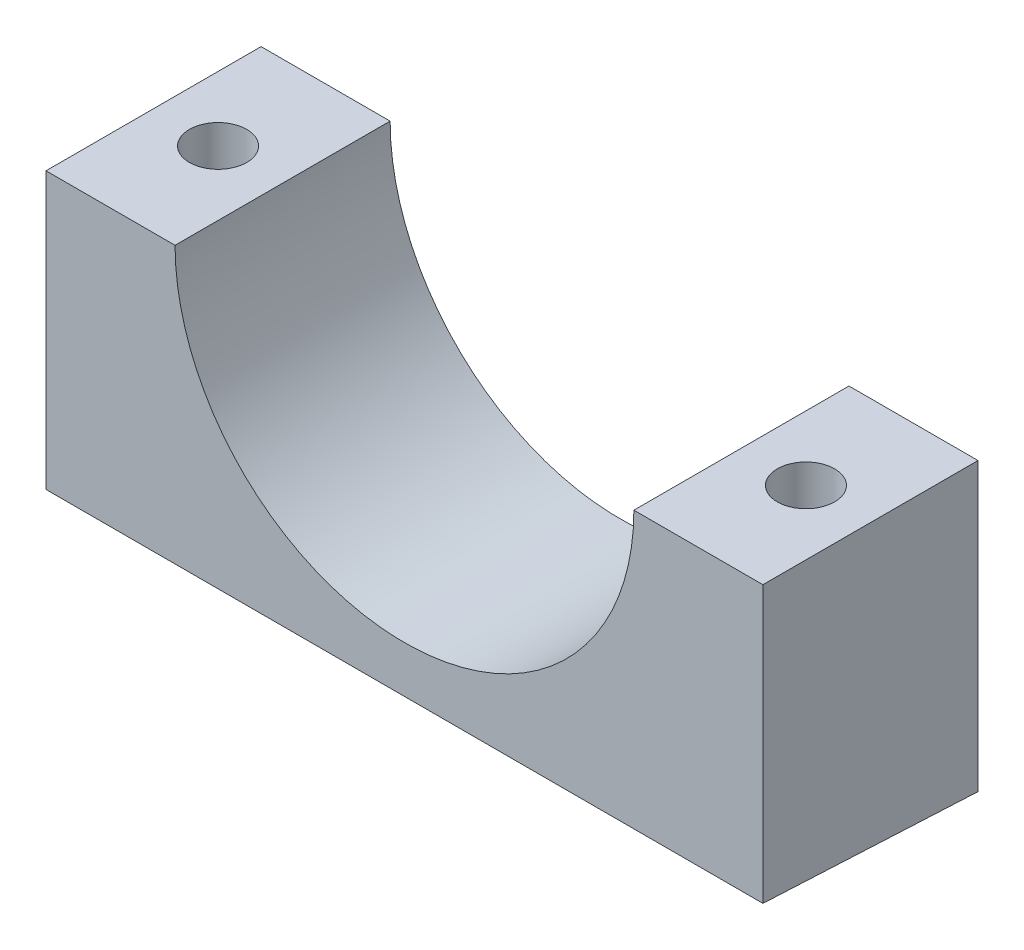
ISO-10303-21;
HEADER;
FILE_DESCRIPTION(('STEP AP214'),'2;1');
FILE_NAME('part.step','',(''),(''),'','','');
FILE_SCHEMA(('AUTOMOTIVE_DESIGN { 1 0 10303 214 1 1 1 1 }'));
ENDSEC;
DATA;
#1=APPLICATION_CONTEXT('core data for automotive mechanical design processes');
#2=APPLICATION_PROTOCOL_DEFINITION('international standard','automotive_design',2000,#1);
#3=PRODUCT_CONTEXT('',#1,'mechanical');
#4=PRODUCT('Part','Part','',(#3));
#5=PRODUCT_RELATED_PRODUCT_CATEGORY('part','',(#4));
#6=PRODUCT_DEFINITION_FORMATION('','',#4);
#7=PRODUCT_DEFINITION_CONTEXT('part definition',#1,'design');
#8=PRODUCT_DEFINITION('design','',#6,#7);
#9=PRODUCT_DEFINITION_SHAPE('','',#8);
#10=(LENGTH_UNIT() NAMED_UNIT(*) SI_UNIT(.MILLI.,.METRE.));
#11=(NAMED_UNIT(*) PLANE_ANGLE_UNIT() SI_UNIT($,.RADIAN.));
#12=(NAMED_UNIT(*) SI_UNIT($,.STERADIAN.) SOLID_ANGLE_UNIT());
#13=UNCERTAINTY_MEASURE_WITH_UNIT(LENGTH_MEASURE(1.E-05),#10,'distance_accuracy_value','');
#14=(GEOMETRIC_REPRESENTATION_CONTEXT(3) GLOBAL_UNCERTAINTY_ASSIGNED_CONTEXT((#13)) GLOBAL_UNIT_ASSIGNED_CONTEXT((#10,
#11,#12)) REPRESENTATION_CONTEXT('',''));
#15=CARTESIAN_POINT('',(0.,0.,0.));
#16=DIRECTION('',(0.,0.,1.));
#17=DIRECTION('',(1.,0.,0.));
#18=AXIS2_PLACEMENT_3D('',#15,#16,#17);
#19=CARTESIAN_POINT('',(-25.,10.,15.));
#20=DIRECTION('',(0.,-1.,0.));
#21=DIRECTION('',(0.,0.,-1.));
#22=AXIS2_PLACEMENT_3D('',#19,#20,#21);
#23=PLANE('',#22);
#24=CARTESIAN_POINT('',(-20.5,10.,7.5));
#25=DIRECTION('',(0.,-1.,0.));
#26=DIRECTION('',(0.,0.,1.));
#27=AXIS2_PLACEMENT_3D('',#24,#25,#26);
#28=CIRCLE('',#27,2.);
#29=CARTESIAN_POINT('',(-20.5,10.,9.5));
#30=VERTEX_POINT('',#29);
#31=EDGE_CURVE('E149',#30,#30,#28,.T.);
#32=ORIENTED_EDGE('',*,*,#31,.T.);
#33=EDGE_LOOP('',(#32));
#34=FACE_BOUND('',#33,.T.);
#35=DIRECTION('',(-1.,0.,0.));
#36=VECTOR('',#35,1.);
#37=CARTESIAN_POINT('',(-25.,10.,15.));
#38=LINE('',#37,#36);
#39=CARTESIAN_POINT('',(-16.,10.,15.));
#40=VERTEX_POINT('',#39);
#41=CARTESIAN_POINT('',(-25.,10.,15.));
#42=VERTEX_POINT('',#41);
#43=EDGE_CURVE('E101',#40,#42,#38,.T.);
#44=ORIENTED_EDGE('',*,*,#43,.F.);
#45=DIRECTION('',(0.,0.,-1.));
#46=VECTOR('',#45,1.);
#47=CARTESIAN_POINT('',(-16.,10.,15.));
#48=LINE('',#47,#46);
#49=CARTESIAN_POINT('',(-16.,10.,0.));
#50=VERTEX_POINT('',#49);
#51=EDGE_CURVE('E89',#40,#50,#48,.T.);
#52=ORIENTED_EDGE('',*,*,#51,.T.);
#53=DIRECTION('',(-1.,0.,0.));
#54=VECTOR('',#53,1.);
#55=CARTESIAN_POINT('',(-25.,10.,0.));
#56=LINE('',#55,#54);
#57=CARTESIAN_POINT('',(-25.,10.,0.));
#58=VERTEX_POINT('',#57);
#59=EDGE_CURVE('E118',#50,#58,#56,.T.);
#60=ORIENTED_EDGE('',*,*,#59,.T.);
#61=DIRECTION('',(0.,0.,-1.));
#62=VECTOR('',#61,1.);
#63=CARTESIAN_POINT('',(-25.,10.,15.));
#64=LINE('',#63,#62);
#65=EDGE_CURVE('E45',#42,#58,#64,.T.);
#66=ORIENTED_EDGE('',*,*,#65,.F.);
#67=EDGE_LOOP('',(#44,#52,#60,#66));
#68=FACE_BOUND('',#67,.T.);
#69=ADVANCED_FACE('F37',(#34,#68),#23,.F.);
#70=CARTESIAN_POINT('',(25.,-10.,15.));
#71=DIRECTION('',(-1.,0.,0.));
#72=DIRECTION('',(0.,0.,1.));
#73=AXIS2_PLACEMENT_3D('',#70,#71,#72);
#74=PLANE('',#73);
#75=DIRECTION('',(0.,0.0499376169438853,0.998752338877845));
#76=VECTOR('',#75,1.);
#77=CARTESIAN_POINT('',(25.,-9.25187032418963,14.9625935162095));
#78=LINE('',#77,#76);
#79=CARTESIAN_POINT('',(25.,-10.,0.));
#80=VERTEX_POINT('',#79);
#81=CARTESIAN_POINT('',(25.,-9.2500000000001,15.));
#82=VERTEX_POINT('',#81);
#83=EDGE_CURVE('E119',#80,#82,#78,.T.);
#84=ORIENTED_EDGE('',*,*,#83,.F.);
#85=DIRECTION('',(0.,1.,0.));
#86=VECTOR('',#85,1.);
#87=CARTESIAN_POINT('',(25.,-10.,0.));
#88=LINE('',#87,#86);
#89=CARTESIAN_POINT('',(25.,10.,0.));
#90=VERTEX_POINT('',#89);
#91=EDGE_CURVE('E115',#80,#90,#88,.T.);
#92=ORIENTED_EDGE('',*,*,#91,.T.);
#93=DIRECTION('',(0.,0.,-1.));
#94=VECTOR('',#93,1.);
#95=CARTESIAN_POINT('',(25.,10.,15.));
#96=LINE('',#95,#94);
#97=CARTESIAN_POINT('',(25.,10.,15.));
#98=VERTEX_POINT('',#97);
#99=EDGE_CURVE('E11',#98,#90,#96,.T.);
#100=ORIENTED_EDGE('',*,*,#99,.F.);
#101=DIRECTION('',(0.,1.,0.));
#102=VECTOR('',#101,1.);
#103=CARTESIAN_POINT('',(25.,-10.,15.));
#104=LINE('',#103,#102);
#105=EDGE_CURVE('E107',#82,#98,#104,.T.);
#106=ORIENTED_EDGE('',*,*,#105,.F.);
#107=EDGE_LOOP('',(#84,#92,#100,#106));
#108=FACE_BOUND('',#107,.T.);
#109=ADVANCED_FACE('F39',(#108),#74,.F.);
#110=CARTESIAN_POINT('',(-25.,-10.,15.));
#111=DIRECTION('',(1.,0.,0.));
#112=DIRECTION('',(0.,0.,-1.));
#113=AXIS2_PLACEMENT_3D('',#110,#111,#112);
#114=PLANE('',#113);
#115=DIRECTION('',(0.,-0.0499376169438853,-0.998752338877845));
#116=VECTOR('',#115,1.);
#117=CARTESIAN_POINT('',(-25.,-9.25187032418963,14.9625935162095));
#118=LINE('',#117,#116);
#119=CARTESIAN_POINT('',(-25.,-9.2500000000001,15.));
#120=VERTEX_POINT('',#119);
#121=CARTESIAN_POINT('',(-25.,-10.,0.));
#122=VERTEX_POINT('',#121);
#123=EDGE_CURVE('E60',#120,#122,#118,.T.);
#124=ORIENTED_EDGE('',*,*,#123,.F.);
#125=DIRECTION('',(0.,-1.,0.));
#126=VECTOR('',#125,1.);
#127=CARTESIAN_POINT('',(-25.,-10.,15.));
#128=LINE('',#127,#126);
#129=EDGE_CURVE('E109',#42,#120,#128,.T.);
#130=ORIENTED_EDGE('',*,*,#129,.F.);
#131=ORIENTED_EDGE('',*,*,#65,.T.);
#132=DIRECTION('',(0.,-1.,0.));
#133=VECTOR('',#132,1.);
#134=CARTESIAN_POINT('',(-25.,-10.,0.));
#135=LINE('',#134,#133);
#136=EDGE_CURVE('E123',#58,#122,#135,.T.);
#137=ORIENTED_EDGE('',*,*,#136,.T.);
#138=EDGE_LOOP('',(#124,#130,#131,#137));
#139=FACE_BOUND('',#138,.T.);
#140=ADVANCED_FACE('F127',(#139),#114,.F.);
#141=CARTESIAN_POINT('',(0.,0.,15.));
#142=DIRECTION('',(0.,0.,-1.));
#143=DIRECTION('',(-1.,0.,0.));
#144=AXIS2_PLACEMENT_3D('',#141,#142,#143);
#145=PLANE('',#144);
#146=CARTESIAN_POINT('',(16.,10.,15.));
#147=VERTEX_POINT('',#146);
#148=EDGE_CURVE('E104',#98,#147,#38,.T.);
#149=ORIENTED_EDGE('',*,*,#148,.T.);
#150=CARTESIAN_POINT('',(0.,10.,15.));
#151=DIRECTION('',(0.,0.,-1.));
#152=DIRECTION('',(-1.,0.,0.));
#153=AXIS2_PLACEMENT_3D('',#150,#151,#152);
#154=CIRCLE('',#153,16.);
#155=EDGE_CURVE('E92',#147,#40,#154,.T.);
#156=ORIENTED_EDGE('',*,*,#155,.T.);
#157=ORIENTED_EDGE('',*,*,#43,.T.);
#158=ORIENTED_EDGE('',*,*,#129,.T.);
#159=DIRECTION('',(-1.,0.,0.));
#160=VECTOR('',#159,1.);
#161=CARTESIAN_POINT('',(94.8771242968684,-9.2500000000001,15.));
#162=LINE('',#161,#160);
#163=EDGE_CURVE('E136',#82,#120,#162,.T.);
#164=ORIENTED_EDGE('',*,*,#163,.F.);
#165=ORIENTED_EDGE('',*,*,#105,.T.);
#166=EDGE_LOOP('',(#149,#156,#157,#158,#164,#165));
#167=FACE_BOUND('',#166,.T.);
#168=ADVANCED_FACE('F100',(#167),#145,.F.);
#169=CARTESIAN_POINT('',(20.5,10.,7.5));
#170=DIRECTION('',(0.,1.,0.));
#171=DIRECTION('',(0.,0.,1.));
#172=AXIS2_PLACEMENT_3D('',#169,#170,#171);
#173=CIRCLE('',#172,2.);
#174=CARTESIAN_POINT('',(20.5,10.,9.5));
#175=VERTEX_POINT('',#174);
#176=EDGE_CURVE('E143',#175,#175,#173,.T.);
#177=ORIENTED_EDGE('',*,*,#176,.F.);
#178=EDGE_LOOP('',(#177));
#179=FACE_BOUND('',#178,.T.);
#180=CARTESIAN_POINT('',(16.,10.,0.));
#181=VERTEX_POINT('',#180);
#182=EDGE_CURVE('E120',#90,#181,#56,.T.);
#183=ORIENTED_EDGE('',*,*,#182,.T.);
#184=DIRECTION('',(0.,0.,-1.));
#185=VECTOR('',#184,1.);
#186=CARTESIAN_POINT('',(16.,10.,15.));
#187=LINE('',#186,#185);
#188=EDGE_CURVE('E52',#147,#181,#187,.T.);
#189=ORIENTED_EDGE('',*,*,#188,.F.);
#190=ORIENTED_EDGE('',*,*,#148,.F.);
#191=ORIENTED_EDGE('',*,*,#99,.T.);
#192=EDGE_LOOP('',(#183,#189,#190,#191));
#193=FACE_BOUND('',#192,.T.);
#194=ADVANCED_FACE('F168',(#179,#193),#23,.F.);
#195=CARTESIAN_POINT('',(0.,0.,0.));
#196=DIRECTION('',(0.,0.,-1.));
#197=DIRECTION('',(-1.,0.,0.));
#198=AXIS2_PLACEMENT_3D('',#195,#196,#197);
#199=PLANE('',#198);
#200=CARTESIAN_POINT('',(0.,10.,0.));
#201=DIRECTION('',(0.,0.,-1.));
#202=DIRECTION('',(-1.,0.,0.));
#203=AXIS2_PLACEMENT_3D('',#200,#201,#202);
#204=CIRCLE('',#203,16.);
#205=EDGE_CURVE('E93',#181,#50,#204,.T.);
#206=ORIENTED_EDGE('',*,*,#205,.F.);
#207=ORIENTED_EDGE('',*,*,#182,.F.);
#208=ORIENTED_EDGE('',*,*,#91,.F.);
#209=DIRECTION('',(1.,0.,0.));
#210=VECTOR('',#209,1.);
#211=CARTESIAN_POINT('',(-25.,-10.,0.));
#212=LINE('',#211,#210);
#213=EDGE_CURVE('E110',#122,#80,#212,.T.);
#214=ORIENTED_EDGE('',*,*,#213,.F.);
#215=ORIENTED_EDGE('',*,*,#136,.F.);
#216=ORIENTED_EDGE('',*,*,#59,.F.);
#217=EDGE_LOOP('',(#206,#207,#208,#214,#215,#216));
#218=FACE_BOUND('',#217,.T.);
#219=ADVANCED_FACE('F130',(#218),#199,.T.);
#220=CARTESIAN_POINT('',(94.8771242968684,-10.,0.));
#221=DIRECTION('',(0.,-0.998752338877845,0.0499376169438853));
#222=DIRECTION('',(0.,-0.0499376169438853,-0.998752338877845));
#223=AXIS2_PLACEMENT_3D('',#220,#221,#222);
#224=PLANE('',#223);
#225=ORIENTED_EDGE('',*,*,#213,.T.);
#226=ORIENTED_EDGE('',*,*,#83,.T.);
#227=ORIENTED_EDGE('',*,*,#163,.T.);
#228=ORIENTED_EDGE('',*,*,#123,.T.);
#229=EDGE_LOOP('',(#225,#226,#227,#228));
#230=FACE_BOUND('',#229,.T.);
#231=ADVANCED_FACE('F135',(#230),#224,.T.);
#232=CARTESIAN_POINT('',(0.,10.,15.));
#233=DIRECTION('',(0.,0.,-1.));
#234=DIRECTION('',(-1.,0.,0.));
#235=AXIS2_PLACEMENT_3D('',#232,#233,#234);
#236=CYLINDRICAL_SURFACE('',#235,16.);
#237=ORIENTED_EDGE('',*,*,#205,.T.);
#238=ORIENTED_EDGE('',*,*,#51,.F.);
#239=ORIENTED_EDGE('',*,*,#155,.F.);
#240=ORIENTED_EDGE('',*,*,#188,.T.);
#241=EDGE_LOOP('',(#237,#238,#239,#240));
#242=FACE_BOUND('',#241,.T.);
#243=ADVANCED_FACE('F91',(#242),#236,.F.);
#244=CARTESIAN_POINT('',(20.5,0.,7.5));
#245=DIRECTION('',(0.,1.,0.));
#246=DIRECTION('',(0.,0.,1.));
#247=AXIS2_PLACEMENT_3D('',#244,#245,#246);
#248=CYLINDRICAL_SURFACE('',#247,2.);
#249=CARTESIAN_POINT('',(20.5,0.,7.5));
#250=DIRECTION('',(0.,1.,0.));
#251=DIRECTION('',(0.,0.,1.));
#252=AXIS2_PLACEMENT_3D('',#249,#250,#251);
#253=CIRCLE('',#252,2.);
#254=CARTESIAN_POINT('',(20.5,0.,9.5));
#255=VERTEX_POINT('',#254);
#256=EDGE_CURVE('E141',#255,#255,#253,.T.);
#257=ORIENTED_EDGE('',*,*,#256,.F.);
#258=EDGE_LOOP('',(#257));
#259=FACE_BOUND('',#258,.T.);
#260=ORIENTED_EDGE('',*,*,#176,.T.);
#261=EDGE_LOOP('',(#260));
#262=FACE_BOUND('',#261,.T.);
#263=ADVANCED_FACE('F187',(#259,#262),#248,.F.);
#264=CARTESIAN_POINT('',(20.5,0.,7.5));
#265=DIRECTION('',(0.,1.,0.));
#266=DIRECTION('',(0.,0.,1.));
#267=AXIS2_PLACEMENT_3D('',#264,#265,#266);
#268=PLANE('',#267);
#269=ORIENTED_EDGE('',*,*,#256,.T.);
#270=EDGE_LOOP('',(#269));
#271=FACE_BOUND('',#270,.T.);
#272=ADVANCED_FACE('F164',(#271),#268,.T.);
#273=CARTESIAN_POINT('',(-20.5,0.,7.5));
#274=DIRECTION('',(0.,1.,0.));
#275=DIRECTION('',(0.,0.,1.));
#276=AXIS2_PLACEMENT_3D('',#273,#274,#275);
#277=CYLINDRICAL_SURFACE('',#276,2.);
#278=CARTESIAN_POINT('',(-20.5,0.,7.5));
#279=DIRECTION('',(0.,-1.,0.));
#280=DIRECTION('',(0.,0.,1.));
#281=AXIS2_PLACEMENT_3D('',#278,#279,#280);
#282=CIRCLE('',#281,2.);
#283=CARTESIAN_POINT('',(-20.5,0.,9.5));
#284=VERTEX_POINT('',#283);
#285=EDGE_CURVE('E146',#284,#284,#282,.T.);
#286=ORIENTED_EDGE('',*,*,#285,.T.);
#287=EDGE_LOOP('',(#286));
#288=FACE_BOUND('',#287,.T.);
#289=ORIENTED_EDGE('',*,*,#31,.F.);
#290=EDGE_LOOP('',(#289));
#291=FACE_BOUND('',#290,.T.);
#292=ADVANCED_FACE('F155',(#288,#291),#277,.F.);
#293=CARTESIAN_POINT('',(-20.5,0.,7.5));
#294=DIRECTION('',(0.,1.,0.));
#295=DIRECTION('',(0.,0.,1.));
#296=AXIS2_PLACEMENT_3D('',#293,#294,#295);
#297=PLANE('',#296);
#298=ORIENTED_EDGE('',*,*,#285,.F.);
#299=EDGE_LOOP('',(#298));
#300=FACE_BOUND('',#299,.T.);
#301=ADVANCED_FACE('F158',(#300),#297,.T.);
#302=CLOSED_SHELL('',(#69,#109,#140,#168,#194,#219,#231,#243,#263,#272,#292,#301));
#303=MANIFOLD_SOLID_BREP('B2',#302);
#304=ADVANCED_BREP_SHAPE_REPRESENTATION('',(#18,#303),#14);
#305=SHAPE_DEFINITION_REPRESENTATION(#9,#304);
ENDSEC;
END-ISO-10303-21;
